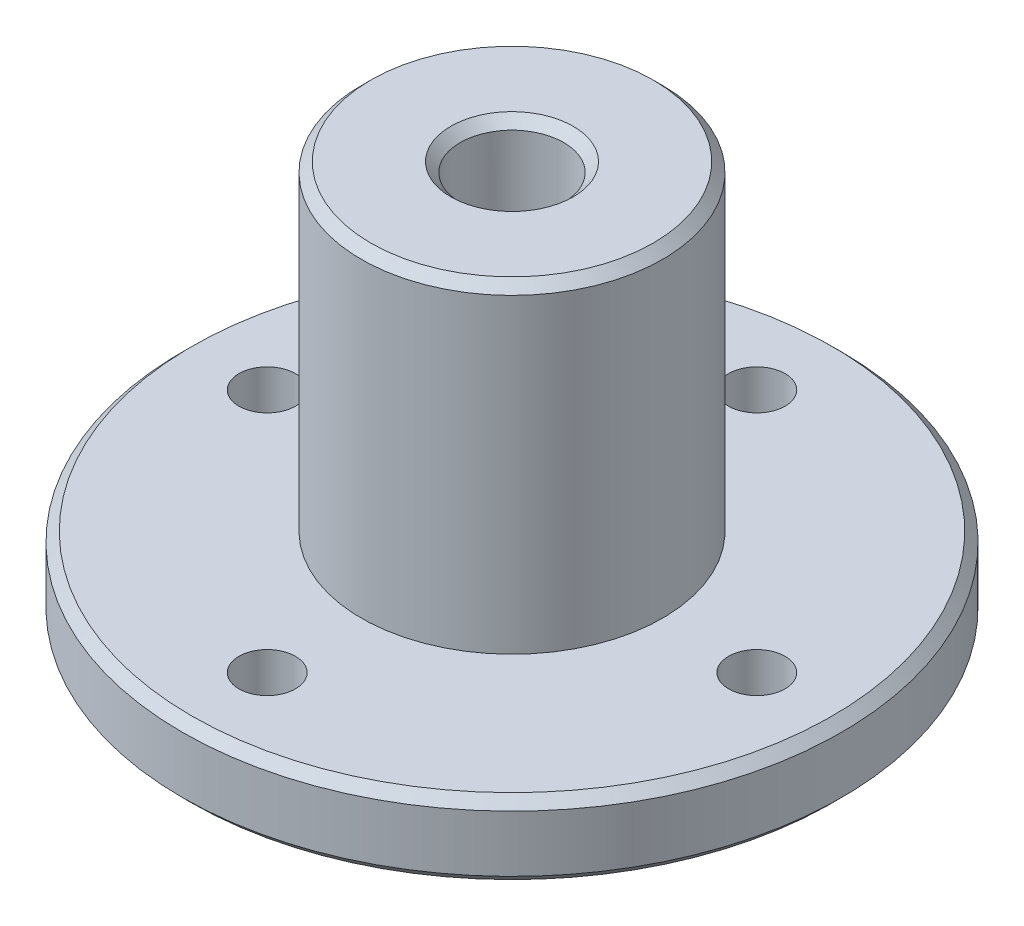
ISO-10303-21;
HEADER;
FILE_DESCRIPTION(('STEP AP214'),'2;1');
FILE_NAME('part.step','',(''),(''),'','','');
FILE_SCHEMA(('AUTOMOTIVE_DESIGN { 1 0 10303 214 1 1 1 1 }'));
ENDSEC;
DATA;
#1=APPLICATION_CONTEXT('core data for automotive mechanical design processes');
#2=APPLICATION_PROTOCOL_DEFINITION('international standard','automotive_design',2000,#1);
#3=PRODUCT_CONTEXT('',#1,'mechanical');
#4=PRODUCT('Part','Part','',(#3));
#5=PRODUCT_RELATED_PRODUCT_CATEGORY('part','',(#4));
#6=PRODUCT_DEFINITION_FORMATION('','',#4);
#7=PRODUCT_DEFINITION_CONTEXT('part definition',#1,'design');
#8=PRODUCT_DEFINITION('design','',#6,#7);
#9=PRODUCT_DEFINITION_SHAPE('','',#8);
#10=(LENGTH_UNIT() NAMED_UNIT(*) SI_UNIT(.MILLI.,.METRE.));
#11=(NAMED_UNIT(*) PLANE_ANGLE_UNIT() SI_UNIT($,.RADIAN.));
#12=(NAMED_UNIT(*) SI_UNIT($,.STERADIAN.) SOLID_ANGLE_UNIT());
#13=UNCERTAINTY_MEASURE_WITH_UNIT(LENGTH_MEASURE(1.E-05),#10,'distance_accuracy_value','');
#14=(GEOMETRIC_REPRESENTATION_CONTEXT(3) GLOBAL_UNCERTAINTY_ASSIGNED_CONTEXT((#13)) GLOBAL_UNIT_ASSIGNED_CONTEXT((#10,
#11,#12)) REPRESENTATION_CONTEXT('',''));
#15=CARTESIAN_POINT('',(0.,0.,0.));
#16=DIRECTION('',(0.,0.,1.));
#17=DIRECTION('',(1.,0.,0.));
#18=AXIS2_PLACEMENT_3D('',#15,#16,#17);
#19=CARTESIAN_POINT('',(0.,-5.,0.));
#20=DIRECTION('',(0.,1.,0.));
#21=DIRECTION('',(0.,0.,1.));
#22=AXIS2_PLACEMENT_3D('',#19,#20,#21);
#23=CYLINDRICAL_SURFACE('',#22,5.5);
#24=CARTESIAN_POINT('',(0.,0.499999999999979,0.));
#25=DIRECTION('',(0.,1.,0.));
#26=DIRECTION('',(0.,0.,1.));
#27=AXIS2_PLACEMENT_3D('',#24,#25,#26);
#28=CIRCLE('',#27,5.5);
#29=CARTESIAN_POINT('',(0.,0.499999999999979,5.5));
#30=VERTEX_POINT('',#29);
#31=EDGE_CURVE('E76',#30,#30,#28,.F.);
#32=CARTESIAN_POINT('',(0.,12.,0.));
#33=DIRECTION('',(0.,1.,0.));
#34=DIRECTION('',(0.,0.,1.));
#35=AXIS2_PLACEMENT_3D('',#32,#33,#34);
#36=CIRCLE('',#35,5.5);
#37=CARTESIAN_POINT('',(0.,12.,5.5));
#38=VERTEX_POINT('',#37);
#39=EDGE_CURVE('E116',#38,#38,#36,.F.);
#40=CARTESIAN_POINT('',(0.,0.499999999999979,5.5));
#41=CARTESIAN_POINT('',(0.,0.619791666666645,5.5));
#42=CARTESIAN_POINT('',(0.,0.739583333333312,5.5));
#43=CARTESIAN_POINT('',(0.,0.979166666666646,5.5));
#44=CARTESIAN_POINT('',(0.,1.09895833333331,5.5));
#45=CARTESIAN_POINT('',(0.,1.33854166666665,5.5));
#46=CARTESIAN_POINT('',(0.,1.45833333333331,5.5));
#47=CARTESIAN_POINT('',(0.,1.69791666666665,5.5));
#48=CARTESIAN_POINT('',(0.,1.81770833333331,5.5));
#49=CARTESIAN_POINT('',(0.,2.05729166666665,5.5));
#50=CARTESIAN_POINT('',(0.,2.17708333333332,5.5));
#51=CARTESIAN_POINT('',(0.,2.41666666666665,5.5));
#52=CARTESIAN_POINT('',(0.,2.53645833333332,5.5));
#53=CARTESIAN_POINT('',(0.,2.77604166666665,5.5));
#54=CARTESIAN_POINT('',(0.,2.89583333333332,5.5));
#55=CARTESIAN_POINT('',(0.,3.13541666666665,5.5));
#56=CARTESIAN_POINT('',(0.,3.25520833333332,5.5));
#57=CARTESIAN_POINT('',(0.,3.49479166666665,5.5));
#58=CARTESIAN_POINT('',(0.,3.61458333333332,5.5));
#59=CARTESIAN_POINT('',(0.,3.85416666666665,5.5));
#60=CARTESIAN_POINT('',(0.,3.97395833333332,5.5));
#61=CARTESIAN_POINT('',(0.,4.21354166666665,5.5));
#62=CARTESIAN_POINT('',(0.,4.33333333333332,5.5));
#63=CARTESIAN_POINT('',(0.,4.57291666666665,5.5));
#64=CARTESIAN_POINT('',(0.,4.69270833333332,5.5));
#65=CARTESIAN_POINT('',(0.,4.93229166666665,5.5));
#66=CARTESIAN_POINT('',(0.,5.05208333333332,5.5));
#67=CARTESIAN_POINT('',(0.,5.29166666666665,5.5));
#68=CARTESIAN_POINT('',(0.,5.41145833333332,5.5));
#69=CARTESIAN_POINT('',(0.,5.65104166666665,5.5));
#70=CARTESIAN_POINT('',(0.,5.77083333333332,5.5));
#71=CARTESIAN_POINT('',(0.,6.01041666666665,5.5));
#72=CARTESIAN_POINT('',(0.,6.13020833333332,5.5));
#73=CARTESIAN_POINT('',(0.,6.36979166666665,5.5));
#74=CARTESIAN_POINT('',(0.,6.48958333333332,5.5));
#75=CARTESIAN_POINT('',(0.,6.72916666666666,5.5));
#76=CARTESIAN_POINT('',(0.,6.84895833333332,5.5));
#77=CARTESIAN_POINT('',(0.,7.08854166666666,5.5));
#78=CARTESIAN_POINT('',(0.,7.20833333333332,5.5));
#79=CARTESIAN_POINT('',(0.,7.44791666666666,5.5));
#80=CARTESIAN_POINT('',(0.,7.56770833333332,5.5));
#81=CARTESIAN_POINT('',(0.,7.80729166666666,5.5));
#82=CARTESIAN_POINT('',(0.,7.92708333333332,5.5));
#83=CARTESIAN_POINT('',(0.,8.16666666666666,5.5));
#84=CARTESIAN_POINT('',(0.,8.28645833333333,5.5));
#85=CARTESIAN_POINT('',(0.,8.52604166666666,5.5));
#86=CARTESIAN_POINT('',(0.,8.64583333333333,5.5));
#87=CARTESIAN_POINT('',(0.,8.88541666666666,5.5));
#88=CARTESIAN_POINT('',(0.,9.00520833333333,5.5));
#89=CARTESIAN_POINT('',(0.,9.24479166666666,5.5));
#90=CARTESIAN_POINT('',(0.,9.36458333333333,5.5));
#91=CARTESIAN_POINT('',(0.,9.60416666666666,5.5));
#92=CARTESIAN_POINT('',(0.,9.72395833333333,5.5));
#93=CARTESIAN_POINT('',(0.,9.96354166666666,5.5));
#94=CARTESIAN_POINT('',(0.,10.0833333333333,5.5));
#95=CARTESIAN_POINT('',(0.,10.3229166666667,5.5));
#96=CARTESIAN_POINT('',(0.,10.4427083333333,5.5));
#97=CARTESIAN_POINT('',(0.,10.6822916666667,5.5));
#98=CARTESIAN_POINT('',(0.,10.8020833333333,5.5));
#99=CARTESIAN_POINT('',(0.,11.0416666666667,5.5));
#100=CARTESIAN_POINT('',(0.,11.1614583333333,5.5));
#101=CARTESIAN_POINT('',(0.,11.4010416666667,5.5));
#102=CARTESIAN_POINT('',(0.,11.5208333333333,5.5));
#103=CARTESIAN_POINT('',(0.,11.7604166666667,5.5));
#104=CARTESIAN_POINT('',(0.,11.8802083333333,5.5));
#105=CARTESIAN_POINT('',(0.,12.,5.5));
#106=B_SPLINE_CURVE_WITH_KNOTS('',3,(#40,#41,#42,#43,#44,#45,#46,#47,#48,#49,#50,#51,#52,#53,
#54,#55,#56,#57,#58,#59,#60,#61,#62,#63,#64,#65,#66,#67,#68,#69,#70,#71,#72,#73,#74,#75,#76,#77,
#78,#79,#80,#81,#82,#83,#84,#85,#86,#87,#88,#89,#90,#91,#92,#93,#94,#95,#96,#97,#98,#99,#100,
#101,#102,#103,#104,#105),.UNSPECIFIED.,.F.,.F.,(4,2,2,2,2,2,2,2,2,2,2,2,2,2,2,2,2,2,2,2,2,2,2,
2,2,2,2,2,2,2,2,2,4),(0.,0.359375,0.718750000000002,1.078125,1.4375,1.796875,2.15625,2.515625,
2.87500000000001,3.23437500000001,3.59375000000001,3.95312500000001,4.31250000000001,
4.67187500000001,5.03125000000001,5.39062500000001,5.75000000000001,6.10937500000001,
6.46875000000001,6.82812500000001,7.18750000000001,7.54687500000001,7.90625000000001,
8.26562500000001,8.62500000000001,8.98437500000002,9.34375000000002,9.70312500000002,10.0625,
10.421875,10.78125,11.140625,11.5),.UNSPECIFIED.);
#107=EDGE_CURVE('BSEAM52',#30,#38,#106,.T.);
#108=ORIENTED_EDGE('',*,*,#31,.T.);
#109=ORIENTED_EDGE('',*,*,#39,.F.);
#110=ORIENTED_EDGE('',*,*,#107,.T.);
#111=ORIENTED_EDGE('',*,*,#107,.F.);
#112=EDGE_LOOP('',(#108,#110,#109,#111));
#113=FACE_BOUND('',#112,.T.);
#114=ADVANCED_FACE('F52',(#113),#23,.F.);
#115=CARTESIAN_POINT('',(0.,4.,0.));
#116=DIRECTION('',(0.,-1.,0.));
#117=DIRECTION('',(0.,0.,-1.));
#118=AXIS2_PLACEMENT_3D('',#115,#116,#117);
#119=CYLINDRICAL_SURFACE('',#118,17.5);
#120=CARTESIAN_POINT('',(0.,0.500000000000004,0.));
#121=DIRECTION('',(0.,1.,0.));
#122=DIRECTION('',(0.,0.,1.));
#123=AXIS2_PLACEMENT_3D('',#120,#121,#122);
#124=CIRCLE('',#123,17.5);
#125=CARTESIAN_POINT('',(0.,0.500000000000004,17.5));
#126=VERTEX_POINT('',#125);
#127=EDGE_CURVE('E97',#126,#126,#124,.T.);
#128=ORIENTED_EDGE('',*,*,#127,.T.);
#129=EDGE_LOOP('',(#128));
#130=FACE_BOUND('',#129,.T.);
#131=CARTESIAN_POINT('',(0.,3.5,0.));
#132=DIRECTION('',(0.,1.,0.));
#133=DIRECTION('',(0.,0.,1.));
#134=AXIS2_PLACEMENT_3D('',#131,#132,#133);
#135=CIRCLE('',#134,17.5);
#136=CARTESIAN_POINT('',(0.,3.5,17.5));
#137=VERTEX_POINT('',#136);
#138=EDGE_CURVE('E100',#137,#137,#135,.F.);
#139=ORIENTED_EDGE('',*,*,#138,.T.);
#140=EDGE_LOOP('',(#139));
#141=FACE_BOUND('',#140,.T.);
#142=ADVANCED_FACE('F155',(#130,#141),#119,.T.);
#143=CARTESIAN_POINT('',(0.,4.,0.));
#144=DIRECTION('',(0.,1.,0.));
#145=DIRECTION('',(0.,0.,1.));
#146=AXIS2_PLACEMENT_3D('',#143,#144,#145);
#147=PLANE('',#146);
#148=CARTESIAN_POINT('',(0.,4.,0.));
#149=DIRECTION('',(0.,1.,0.));
#150=DIRECTION('',(0.,0.,1.));
#151=AXIS2_PLACEMENT_3D('',#148,#149,#150);
#152=CIRCLE('',#151,17.);
#153=CARTESIAN_POINT('',(0.,4.,17.));
#154=VERTEX_POINT('',#153);
#155=EDGE_CURVE('E11',#154,#154,#152,.T.);
#156=ORIENTED_EDGE('',*,*,#155,.T.);
#157=EDGE_LOOP('',(#156));
#158=FACE_BOUND('',#157,.T.);
#159=CARTESIAN_POINT('',(0.,4.,-13.));
#160=DIRECTION('',(0.,1.,0.));
#161=DIRECTION('',(0.,0.,1.));
#162=AXIS2_PLACEMENT_3D('',#159,#160,#161);
#163=CIRCLE('',#162,1.5);
#164=CARTESIAN_POINT('',(0.,4.,-11.5));
#165=VERTEX_POINT('',#164);
#166=EDGE_CURVE('E134',#165,#165,#163,.T.);
#167=ORIENTED_EDGE('',*,*,#166,.F.);
#168=EDGE_LOOP('',(#167));
#169=FACE_BOUND('',#168,.T.);
#170=CARTESIAN_POINT('',(13.,4.,0.));
#171=DIRECTION('',(0.,1.,0.));
#172=DIRECTION('',(0.,0.,1.));
#173=AXIS2_PLACEMENT_3D('',#170,#171,#172);
#174=CIRCLE('',#173,1.5);
#175=CARTESIAN_POINT('',(13.,4.,1.5));
#176=VERTEX_POINT('',#175);
#177=EDGE_CURVE('E143',#176,#176,#174,.T.);
#178=ORIENTED_EDGE('',*,*,#177,.F.);
#179=EDGE_LOOP('',(#178));
#180=FACE_BOUND('',#179,.T.);
#181=CARTESIAN_POINT('',(0.,4.,13.));
#182=DIRECTION('',(0.,1.,0.));
#183=DIRECTION('',(0.,0.,1.));
#184=AXIS2_PLACEMENT_3D('',#181,#182,#183);
#185=CIRCLE('',#184,1.5);
#186=CARTESIAN_POINT('',(0.,4.,14.5));
#187=VERTEX_POINT('',#186);
#188=EDGE_CURVE('E140',#187,#187,#185,.T.);
#189=ORIENTED_EDGE('',*,*,#188,.F.);
#190=EDGE_LOOP('',(#189));
#191=FACE_BOUND('',#190,.T.);
#192=CARTESIAN_POINT('',(-13.,4.,0.));
#193=DIRECTION('',(0.,1.,0.));
#194=DIRECTION('',(0.,0.,1.));
#195=AXIS2_PLACEMENT_3D('',#192,#193,#194);
#196=CIRCLE('',#195,1.5);
#197=CARTESIAN_POINT('',(-13.,4.,1.5));
#198=VERTEX_POINT('',#197);
#199=EDGE_CURVE('E137',#198,#198,#196,.T.);
#200=ORIENTED_EDGE('',*,*,#199,.F.);
#201=EDGE_LOOP('',(#200));
#202=FACE_BOUND('',#201,.T.);
#203=CARTESIAN_POINT('',(0.,4.,0.));
#204=DIRECTION('',(0.,1.,0.));
#205=DIRECTION('',(0.,0.,1.));
#206=AXIS2_PLACEMENT_3D('',#203,#204,#205);
#207=CIRCLE('',#206,8.);
#208=CARTESIAN_POINT('',(0.,4.,-8.));
#209=VERTEX_POINT('',#208);
#210=EDGE_CURVE('E115',#209,#209,#207,.F.);
#211=ORIENTED_EDGE('',*,*,#210,.T.);
#212=EDGE_LOOP('',(#211));
#213=FACE_BOUND('',#212,.T.);
#214=ADVANCED_FACE('F151',(#158,#169,#180,#191,#202,#213),#147,.T.);
#215=CARTESIAN_POINT('',(0.,0.,0.));
#216=DIRECTION('',(0.,1.,0.));
#217=DIRECTION('',(0.,0.,1.));
#218=AXIS2_PLACEMENT_3D('',#215,#216,#217);
#219=PLANE('',#218);
#220=CARTESIAN_POINT('',(0.,0.,0.));
#221=DIRECTION('',(0.,1.,0.));
#222=DIRECTION('',(0.,0.,1.));
#223=AXIS2_PLACEMENT_3D('',#220,#221,#222);
#224=CIRCLE('',#223,17.);
#225=CARTESIAN_POINT('',(0.,0.,17.));
#226=VERTEX_POINT('',#225);
#227=EDGE_CURVE('E79',#226,#226,#224,.F.);
#228=ORIENTED_EDGE('',*,*,#227,.T.);
#229=EDGE_LOOP('',(#228));
#230=FACE_BOUND('',#229,.T.);
#231=CARTESIAN_POINT('',(0.,0.,0.));
#232=DIRECTION('',(0.,1.,0.));
#233=DIRECTION('',(0.,0.,1.));
#234=AXIS2_PLACEMENT_3D('',#231,#232,#233);
#235=CIRCLE('',#234,5.99999999999998);
#236=CARTESIAN_POINT('',(0.,0.,5.99999999999998));
#237=VERTEX_POINT('',#236);
#238=EDGE_CURVE('E82',#237,#237,#235,.T.);
#239=ORIENTED_EDGE('',*,*,#238,.T.);
#240=EDGE_LOOP('',(#239));
#241=FACE_BOUND('',#240,.T.);
#242=CARTESIAN_POINT('',(-13.,0.,0.));
#243=DIRECTION('',(0.,1.,0.));
#244=DIRECTION('',(0.,0.,1.));
#245=AXIS2_PLACEMENT_3D('',#242,#243,#244);
#246=CIRCLE('',#245,2.);
#247=CARTESIAN_POINT('',(-13.,0.,2.));
#248=VERTEX_POINT('',#247);
#249=EDGE_CURVE('E85',#248,#248,#246,.T.);
#250=ORIENTED_EDGE('',*,*,#249,.T.);
#251=EDGE_LOOP('',(#250));
#252=FACE_BOUND('',#251,.T.);
#253=CARTESIAN_POINT('',(0.,0.,13.));
#254=DIRECTION('',(0.,1.,0.));
#255=DIRECTION('',(0.,0.,1.));
#256=AXIS2_PLACEMENT_3D('',#253,#254,#255);
#257=CIRCLE('',#256,2.);
#258=CARTESIAN_POINT('',(0.,0.,15.));
#259=VERTEX_POINT('',#258);
#260=EDGE_CURVE('E88',#259,#259,#257,.T.);
#261=ORIENTED_EDGE('',*,*,#260,.T.);
#262=EDGE_LOOP('',(#261));
#263=FACE_BOUND('',#262,.T.);
#264=CARTESIAN_POINT('',(13.,0.,0.));
#265=DIRECTION('',(0.,1.,0.));
#266=DIRECTION('',(0.,0.,1.));
#267=AXIS2_PLACEMENT_3D('',#264,#265,#266);
#268=CIRCLE('',#267,2.);
#269=CARTESIAN_POINT('',(13.,0.,2.));
#270=VERTEX_POINT('',#269);
#271=EDGE_CURVE('E91',#270,#270,#268,.T.);
#272=ORIENTED_EDGE('',*,*,#271,.T.);
#273=EDGE_LOOP('',(#272));
#274=FACE_BOUND('',#273,.T.);
#275=CARTESIAN_POINT('',(0.,0.,-13.));
#276=DIRECTION('',(0.,1.,0.));
#277=DIRECTION('',(0.,0.,1.));
#278=AXIS2_PLACEMENT_3D('',#275,#276,#277);
#279=CIRCLE('',#278,2.);
#280=CARTESIAN_POINT('',(0.,0.,-11.));
#281=VERTEX_POINT('',#280);
#282=EDGE_CURVE('E94',#281,#281,#279,.T.);
#283=ORIENTED_EDGE('',*,*,#282,.T.);
#284=EDGE_LOOP('',(#283));
#285=FACE_BOUND('',#284,.T.);
#286=ADVANCED_FACE('F154',(#230,#241,#252,#263,#274,#285),#219,.F.);
#287=CARTESIAN_POINT('',(0.,21.,0.));
#288=DIRECTION('',(0.,1.,0.));
#289=DIRECTION('',(0.,0.,1.));
#290=AXIS2_PLACEMENT_3D('',#287,#288,#289);
#291=PLANE('',#290);
#292=CARTESIAN_POINT('',(0.,21.,0.));
#293=DIRECTION('',(0.,1.,0.));
#294=DIRECTION('',(0.,0.,1.));
#295=AXIS2_PLACEMENT_3D('',#292,#293,#294);
#296=CIRCLE('',#295,3.25000000000004);
#297=CARTESIAN_POINT('',(0.,21.,3.25000000000004));
#298=VERTEX_POINT('',#297);
#299=EDGE_CURVE('E106',#298,#298,#296,.F.);
#300=ORIENTED_EDGE('',*,*,#299,.T.);
#301=EDGE_LOOP('',(#300));
#302=FACE_BOUND('',#301,.T.);
#303=CARTESIAN_POINT('',(0.,21.,0.));
#304=DIRECTION('',(0.,1.,0.));
#305=DIRECTION('',(0.,0.,1.));
#306=AXIS2_PLACEMENT_3D('',#303,#304,#305);
#307=CIRCLE('',#306,7.50000000000002);
#308=CARTESIAN_POINT('',(0.,21.,7.50000000000002));
#309=VERTEX_POINT('',#308);
#310=EDGE_CURVE('E109',#309,#309,#307,.T.);
#311=ORIENTED_EDGE('',*,*,#310,.T.);
#312=EDGE_LOOP('',(#311));
#313=FACE_BOUND('',#312,.T.);
#314=ADVANCED_FACE('F168',(#302,#313),#291,.T.);
#315=CARTESIAN_POINT('',(0.,21.,0.));
#316=DIRECTION('',(0.,-1.,0.));
#317=DIRECTION('',(0.,0.,-1.));
#318=AXIS2_PLACEMENT_3D('',#315,#316,#317);
#319=CYLINDRICAL_SURFACE('',#318,8.);
#320=CARTESIAN_POINT('',(0.,20.5,0.));
#321=DIRECTION('',(0.,1.,0.));
#322=DIRECTION('',(0.,0.,1.));
#323=AXIS2_PLACEMENT_3D('',#320,#321,#322);
#324=CIRCLE('',#323,8.);
#325=CARTESIAN_POINT('',(0.,20.5,-8.));
#326=VERTEX_POINT('',#325);
#327=EDGE_CURVE('E103',#326,#326,#324,.F.);
#328=CARTESIAN_POINT('',(0.,20.5,-8.));
#329=CARTESIAN_POINT('',(0.,20.328125,-8.));
#330=CARTESIAN_POINT('',(0.,20.15625,-8.));
#331=CARTESIAN_POINT('',(0.,19.8125,-8.));
#332=CARTESIAN_POINT('',(0.,19.640625,-8.));
#333=CARTESIAN_POINT('',(0.,19.296875,-8.));
#334=CARTESIAN_POINT('',(0.,19.125,-8.));
#335=CARTESIAN_POINT('',(0.,18.78125,-8.));
#336=CARTESIAN_POINT('',(0.,18.609375,-8.));
#337=CARTESIAN_POINT('',(0.,18.265625,-8.));
#338=CARTESIAN_POINT('',(0.,18.09375,-8.));
#339=CARTESIAN_POINT('',(0.,17.75,-8.));
#340=CARTESIAN_POINT('',(0.,17.578125,-8.));
#341=CARTESIAN_POINT('',(0.,17.234375,-8.));
#342=CARTESIAN_POINT('',(0.,17.0625,-8.));
#343=CARTESIAN_POINT('',(0.,16.71875,-8.));
#344=CARTESIAN_POINT('',(0.,16.546875,-8.));
#345=CARTESIAN_POINT('',(0.,16.203125,-8.));
#346=CARTESIAN_POINT('',(0.,16.03125,-8.));
#347=CARTESIAN_POINT('',(0.,15.6875,-8.));
#348=CARTESIAN_POINT('',(0.,15.515625,-8.));
#349=CARTESIAN_POINT('',(0.,15.171875,-8.));
#350=CARTESIAN_POINT('',(0.,15.,-8.));
#351=CARTESIAN_POINT('',(0.,14.65625,-8.));
#352=CARTESIAN_POINT('',(0.,14.484375,-8.));
#353=CARTESIAN_POINT('',(0.,14.140625,-8.));
#354=CARTESIAN_POINT('',(0.,13.96875,-8.));
#355=CARTESIAN_POINT('',(0.,13.625,-8.));
#356=CARTESIAN_POINT('',(0.,13.453125,-8.));
#357=CARTESIAN_POINT('',(0.,13.109375,-8.));
#358=CARTESIAN_POINT('',(0.,12.9375,-8.));
#359=CARTESIAN_POINT('',(0.,12.59375,-8.));
#360=CARTESIAN_POINT('',(0.,12.421875,-8.));
#361=CARTESIAN_POINT('',(0.,12.078125,-8.));
#362=CARTESIAN_POINT('',(0.,11.90625,-8.));
#363=CARTESIAN_POINT('',(0.,11.5625,-8.));
#364=CARTESIAN_POINT('',(0.,11.390625,-8.));
#365=CARTESIAN_POINT('',(0.,11.046875,-8.));
#366=CARTESIAN_POINT('',(0.,10.875,-8.));
#367=CARTESIAN_POINT('',(0.,10.53125,-8.));
#368=CARTESIAN_POINT('',(0.,10.359375,-8.));
#369=CARTESIAN_POINT('',(0.,10.015625,-8.));
#370=CARTESIAN_POINT('',(0.,9.84375,-8.));
#371=CARTESIAN_POINT('',(0.,9.5,-8.));
#372=CARTESIAN_POINT('',(0.,9.328125,-8.));
#373=CARTESIAN_POINT('',(0.,8.984375,-8.));
#374=CARTESIAN_POINT('',(0.,8.8125,-8.));
#375=CARTESIAN_POINT('',(0.,8.46875,-8.));
#376=CARTESIAN_POINT('',(0.,8.296875,-8.));
#377=CARTESIAN_POINT('',(0.,7.953125,-8.));
#378=CARTESIAN_POINT('',(0.,7.78125,-8.));
#379=CARTESIAN_POINT('',(0.,7.4375,-8.));
#380=CARTESIAN_POINT('',(0.,7.265625,-8.));
#381=CARTESIAN_POINT('',(0.,6.921875,-8.));
#382=CARTESIAN_POINT('',(0.,6.75,-8.));
#383=CARTESIAN_POINT('',(0.,6.40625,-8.));
#384=CARTESIAN_POINT('',(0.,6.234375,-8.));
#385=CARTESIAN_POINT('',(0.,5.890625,-8.));
#386=CARTESIAN_POINT('',(0.,5.71875,-8.));
#387=CARTESIAN_POINT('',(0.,5.375,-8.));
#388=CARTESIAN_POINT('',(0.,5.203125,-8.));
#389=CARTESIAN_POINT('',(0.,4.859375,-8.));
#390=CARTESIAN_POINT('',(0.,4.6875,-8.));
#391=CARTESIAN_POINT('',(0.,4.34375,-8.));
#392=CARTESIAN_POINT('',(0.,4.171875,-8.));
#393=CARTESIAN_POINT('',(0.,4.,-8.));
#394=B_SPLINE_CURVE_WITH_KNOTS('',3,(#328,#329,#330,#331,#332,#333,#334,#335,#336,#337,#338,
#339,#340,#341,#342,#343,#344,#345,#346,#347,#348,#349,#350,#351,#352,#353,#354,#355,#356,#357,
#358,#359,#360,#361,#362,#363,#364,#365,#366,#367,#368,#369,#370,#371,#372,#373,#374,#375,#376,
#377,#378,#379,#380,#381,#382,#383,#384,#385,#386,#387,#388,#389,#390,#391,#392,#393),
.UNSPECIFIED.,.F.,.F.,(4,2,2,2,2,2,2,2,2,2,2,2,2,2,2,2,2,2,2,2,2,2,2,2,2,2,2,2,2,2,2,2,4),(0.,
0.515624999999999,1.03125,1.546875,2.0625,2.578125,3.09375,3.609375,4.125,4.640625,5.15625,
5.67187500000001,6.18750000000001,6.70312500000001,7.21875000000001,7.73437500000001,
8.25000000000001,8.76562500000001,9.28125000000001,9.79687500000001,10.3125,10.828125,11.34375,
11.859375,12.375,12.890625,13.40625,13.921875,14.4375,14.953125,15.46875,15.984375,16.5),.UNSPECIFIED.);
#395=EDGE_CURVE('BSEAM165',#326,#209,#394,.T.);
#396=ORIENTED_EDGE('',*,*,#327,.T.);
#397=ORIENTED_EDGE('',*,*,#210,.F.);
#398=ORIENTED_EDGE('',*,*,#395,.T.);
#399=ORIENTED_EDGE('',*,*,#395,.F.);
#400=EDGE_LOOP('',(#396,#398,#397,#399));
#401=FACE_BOUND('',#400,.T.);
#402=ADVANCED_FACE('F165',(#401),#319,.T.);
#403=CARTESIAN_POINT('',(0.,21.,0.));
#404=DIRECTION('',(0.,-1.,0.));
#405=DIRECTION('',(0.,0.,-1.));
#406=AXIS2_PLACEMENT_3D('',#403,#404,#405);
#407=CYLINDRICAL_SURFACE('',#406,2.75);
#408=CARTESIAN_POINT('',(0.,20.5,0.));
#409=DIRECTION('',(0.,1.,0.));
#410=DIRECTION('',(0.,0.,1.));
#411=AXIS2_PLACEMENT_3D('',#408,#409,#410);
#412=CIRCLE('',#411,2.75);
#413=CARTESIAN_POINT('',(0.,20.5,-2.75));
#414=VERTEX_POINT('',#413);
#415=EDGE_CURVE('E112',#414,#414,#412,.T.);
#416=CARTESIAN_POINT('',(0.,16.,0.));
#417=DIRECTION('',(0.,1.,0.));
#418=DIRECTION('',(0.,0.,1.));
#419=AXIS2_PLACEMENT_3D('',#416,#417,#418);
#420=CIRCLE('',#419,2.75);
#421=CARTESIAN_POINT('',(0.,16.,-2.75));
#422=VERTEX_POINT('',#421);
#423=EDGE_CURVE('E124',#422,#422,#420,.T.);
#424=CARTESIAN_POINT('',(0.,20.5,-2.75));
#425=CARTESIAN_POINT('',(0.,20.453125,-2.75));
#426=CARTESIAN_POINT('',(0.,20.40625,-2.75));
#427=CARTESIAN_POINT('',(0.,20.3125,-2.75));
#428=CARTESIAN_POINT('',(0.,20.265625,-2.75));
#429=CARTESIAN_POINT('',(0.,20.171875,-2.75));
#430=CARTESIAN_POINT('',(0.,20.125,-2.75));
#431=CARTESIAN_POINT('',(0.,20.03125,-2.75));
#432=CARTESIAN_POINT('',(0.,19.984375,-2.75));
#433=CARTESIAN_POINT('',(0.,19.890625,-2.75));
#434=CARTESIAN_POINT('',(0.,19.84375,-2.75));
#435=CARTESIAN_POINT('',(0.,19.75,-2.75));
#436=CARTESIAN_POINT('',(0.,19.703125,-2.75));
#437=CARTESIAN_POINT('',(0.,19.609375,-2.75));
#438=CARTESIAN_POINT('',(0.,19.5625,-2.75));
#439=CARTESIAN_POINT('',(0.,19.46875,-2.75));
#440=CARTESIAN_POINT('',(0.,19.421875,-2.75));
#441=CARTESIAN_POINT('',(0.,19.328125,-2.75));
#442=CARTESIAN_POINT('',(0.,19.28125,-2.75));
#443=CARTESIAN_POINT('',(0.,19.1875,-2.75));
#444=CARTESIAN_POINT('',(0.,19.140625,-2.75));
#445=CARTESIAN_POINT('',(0.,19.046875,-2.75));
#446=CARTESIAN_POINT('',(0.,19.,-2.75));
#447=CARTESIAN_POINT('',(0.,18.90625,-2.75));
#448=CARTESIAN_POINT('',(0.,18.859375,-2.75));
#449=CARTESIAN_POINT('',(0.,18.765625,-2.75));
#450=CARTESIAN_POINT('',(0.,18.71875,-2.75));
#451=CARTESIAN_POINT('',(0.,18.625,-2.75));
#452=CARTESIAN_POINT('',(0.,18.578125,-2.75));
#453=CARTESIAN_POINT('',(0.,18.484375,-2.75));
#454=CARTESIAN_POINT('',(0.,18.4375,-2.75));
#455=CARTESIAN_POINT('',(0.,18.34375,-2.75));
#456=CARTESIAN_POINT('',(0.,18.296875,-2.75));
#457=CARTESIAN_POINT('',(0.,18.203125,-2.75));
#458=CARTESIAN_POINT('',(0.,18.15625,-2.75));
#459=CARTESIAN_POINT('',(0.,18.0625,-2.75));
#460=CARTESIAN_POINT('',(0.,18.015625,-2.75));
#461=CARTESIAN_POINT('',(0.,17.921875,-2.75));
#462=CARTESIAN_POINT('',(0.,17.875,-2.75));
#463=CARTESIAN_POINT('',(0.,17.78125,-2.75));
#464=CARTESIAN_POINT('',(0.,17.734375,-2.75));
#465=CARTESIAN_POINT('',(0.,17.640625,-2.75));
#466=CARTESIAN_POINT('',(0.,17.59375,-2.75));
#467=CARTESIAN_POINT('',(0.,17.5,-2.75));
#468=CARTESIAN_POINT('',(0.,17.453125,-2.75));
#469=CARTESIAN_POINT('',(0.,17.359375,-2.75));
#470=CARTESIAN_POINT('',(0.,17.3125,-2.75));
#471=CARTESIAN_POINT('',(0.,17.21875,-2.75));
#472=CARTESIAN_POINT('',(0.,17.171875,-2.75));
#473=CARTESIAN_POINT('',(0.,17.078125,-2.75));
#474=CARTESIAN_POINT('',(0.,17.03125,-2.75));
#475=CARTESIAN_POINT('',(0.,16.9375,-2.75));
#476=CARTESIAN_POINT('',(0.,16.890625,-2.75));
#477=CARTESIAN_POINT('',(0.,16.796875,-2.75));
#478=CARTESIAN_POINT('',(0.,16.75,-2.75));
#479=CARTESIAN_POINT('',(0.,16.65625,-2.75));
#480=CARTESIAN_POINT('',(0.,16.609375,-2.75));
#481=CARTESIAN_POINT('',(0.,16.515625,-2.75));
#482=CARTESIAN_POINT('',(0.,16.46875,-2.75));
#483=CARTESIAN_POINT('',(0.,16.375,-2.75));
#484=CARTESIAN_POINT('',(0.,16.328125,-2.75));
#485=CARTESIAN_POINT('',(0.,16.234375,-2.75));
#486=CARTESIAN_POINT('',(0.,16.1875,-2.75));
#487=CARTESIAN_POINT('',(0.,16.09375,-2.75));
#488=CARTESIAN_POINT('',(0.,16.046875,-2.75));
#489=CARTESIAN_POINT('',(0.,16.,-2.75));
#490=B_SPLINE_CURVE_WITH_KNOTS('',3,(#424,#425,#426,#427,#428,#429,#430,#431,#432,#433,#434,
#435,#436,#437,#438,#439,#440,#441,#442,#443,#444,#445,#446,#447,#448,#449,#450,#451,#452,#453,
#454,#455,#456,#457,#458,#459,#460,#461,#462,#463,#464,#465,#466,#467,#468,#469,#470,#471,#472,
#473,#474,#475,#476,#477,#478,#479,#480,#481,#482,#483,#484,#485,#486,#487,#488,#489),
.UNSPECIFIED.,.F.,.F.,(4,2,2,2,2,2,2,2,2,2,2,2,2,2,2,2,2,2,2,2,2,2,2,2,2,2,2,2,2,2,2,2,4),(0.,
0.140624999999998,0.281249999999997,0.421874999999995,0.562499999999994,0.703124999999995,
0.843749999999994,0.984374999999992,1.12499999999999,1.26562499999999,1.40624999999999,
1.54687499999999,1.68749999999999,1.82812499999999,1.96874999999998,2.10937499999998,
2.24999999999998,2.39062499999998,2.53124999999998,2.67187499999998,2.81249999999998,
2.95312499999998,3.09374999999998,3.23437499999998,3.37499999999998,3.51562499999998,
3.65624999999998,3.79687499999997,3.93749999999997,4.07812499999997,4.21874999999997,
4.35937499999997,4.49999999999997),.UNSPECIFIED.);
#491=EDGE_CURVE('BSEAM167',#414,#422,#490,.T.);
#492=ORIENTED_EDGE('',*,*,#415,.T.);
#493=ORIENTED_EDGE('',*,*,#423,.F.);
#494=ORIENTED_EDGE('',*,*,#491,.T.);
#495=ORIENTED_EDGE('',*,*,#491,.F.);
#496=EDGE_LOOP('',(#492,#494,#493,#495));
#497=FACE_BOUND('',#496,.T.);
#498=ADVANCED_FACE('F167',(#497),#407,.F.);
#499=CARTESIAN_POINT('',(0.,13.1,0.));
#500=DIRECTION('',(0.,1.,0.));
#501=DIRECTION('',(0.,0.,1.));
#502=AXIS2_PLACEMENT_3D('',#499,#500,#501);
#503=CIRCLE('',#502,5.5);
#504=CARTESIAN_POINT('',(0.,13.1,5.5));
#505=VERTEX_POINT('',#504);
#506=EDGE_CURVE('E120',#505,#505,#503,.F.);
#507=CARTESIAN_POINT('',(0.,16.,0.));
#508=DIRECTION('',(0.,1.,0.));
#509=DIRECTION('',(0.,0.,1.));
#510=AXIS2_PLACEMENT_3D('',#507,#508,#509);
#511=CIRCLE('',#510,5.5);
#512=CARTESIAN_POINT('',(0.,16.,5.5));
#513=VERTEX_POINT('',#512);
#514=EDGE_CURVE('E119',#513,#513,#511,.T.);
#515=CARTESIAN_POINT('',(0.,13.1,5.5));
#516=CARTESIAN_POINT('',(0.,13.1302083333333,5.5));
#517=CARTESIAN_POINT('',(0.,13.1604166666667,5.5));
#518=CARTESIAN_POINT('',(0.,13.2208333333333,5.5));
#519=CARTESIAN_POINT('',(0.,13.2510416666667,5.5));
#520=CARTESIAN_POINT('',(0.,13.3114583333333,5.5));
#521=CARTESIAN_POINT('',(0.,13.3416666666667,5.5));
#522=CARTESIAN_POINT('',(0.,13.4020833333333,5.5));
#523=CARTESIAN_POINT('',(0.,13.4322916666667,5.5));
#524=CARTESIAN_POINT('',(0.,13.4927083333333,5.5));
#525=CARTESIAN_POINT('',(0.,13.5229166666667,5.5));
#526=CARTESIAN_POINT('',(0.,13.5833333333333,5.5));
#527=CARTESIAN_POINT('',(0.,13.6135416666667,5.5));
#528=CARTESIAN_POINT('',(0.,13.6739583333333,5.5));
#529=CARTESIAN_POINT('',(0.,13.7041666666667,5.5));
#530=CARTESIAN_POINT('',(0.,13.7645833333333,5.5));
#531=CARTESIAN_POINT('',(0.,13.7947916666667,5.5));
#532=CARTESIAN_POINT('',(0.,13.8552083333333,5.5));
#533=CARTESIAN_POINT('',(0.,13.8854166666667,5.5));
#534=CARTESIAN_POINT('',(0.,13.9458333333333,5.5));
#535=CARTESIAN_POINT('',(0.,13.9760416666667,5.5));
#536=CARTESIAN_POINT('',(0.,14.0364583333333,5.5));
#537=CARTESIAN_POINT('',(0.,14.0666666666667,5.5));
#538=CARTESIAN_POINT('',(0.,14.1270833333333,5.5));
#539=CARTESIAN_POINT('',(0.,14.1572916666667,5.5));
#540=CARTESIAN_POINT('',(0.,14.2177083333333,5.5));
#541=CARTESIAN_POINT('',(0.,14.2479166666667,5.5));
#542=CARTESIAN_POINT('',(0.,14.3083333333333,5.5));
#543=CARTESIAN_POINT('',(0.,14.3385416666667,5.5));
#544=CARTESIAN_POINT('',(0.,14.3989583333333,5.5));
#545=CARTESIAN_POINT('',(0.,14.4291666666667,5.5));
#546=CARTESIAN_POINT('',(0.,14.4895833333333,5.5));
#547=CARTESIAN_POINT('',(0.,14.5197916666667,5.5));
#548=CARTESIAN_POINT('',(0.,14.5802083333333,5.5));
#549=CARTESIAN_POINT('',(0.,14.6104166666667,5.5));
#550=CARTESIAN_POINT('',(0.,14.6708333333333,5.5));
#551=CARTESIAN_POINT('',(0.,14.7010416666667,5.5));
#552=CARTESIAN_POINT('',(0.,14.7614583333333,5.5));
#553=CARTESIAN_POINT('',(0.,14.7916666666667,5.5));
#554=CARTESIAN_POINT('',(0.,14.8520833333333,5.5));
#555=CARTESIAN_POINT('',(0.,14.8822916666667,5.5));
#556=CARTESIAN_POINT('',(0.,14.9427083333333,5.5));
#557=CARTESIAN_POINT('',(0.,14.9729166666667,5.5));
#558=CARTESIAN_POINT('',(0.,15.0333333333333,5.5));
#559=CARTESIAN_POINT('',(0.,15.0635416666667,5.5));
#560=CARTESIAN_POINT('',(0.,15.1239583333333,5.5));
#561=CARTESIAN_POINT('',(0.,15.1541666666667,5.5));
#562=CARTESIAN_POINT('',(0.,15.2145833333333,5.5));
#563=CARTESIAN_POINT('',(0.,15.2447916666667,5.5));
#564=CARTESIAN_POINT('',(0.,15.3052083333333,5.5));
#565=CARTESIAN_POINT('',(0.,15.3354166666667,5.5));
#566=CARTESIAN_POINT('',(0.,15.3958333333333,5.5));
#567=CARTESIAN_POINT('',(0.,15.4260416666667,5.5));
#568=CARTESIAN_POINT('',(0.,15.4864583333333,5.5));
#569=CARTESIAN_POINT('',(0.,15.5166666666667,5.5));
#570=CARTESIAN_POINT('',(0.,15.5770833333333,5.5));
#571=CARTESIAN_POINT('',(0.,15.6072916666667,5.5));
#572=CARTESIAN_POINT('',(0.,15.6677083333333,5.5));
#573=CARTESIAN_POINT('',(0.,15.6979166666667,5.5));
#574=CARTESIAN_POINT('',(0.,15.7583333333333,5.5));
#575=CARTESIAN_POINT('',(0.,15.7885416666667,5.5));
#576=CARTESIAN_POINT('',(0.,15.8489583333333,5.5));
#577=CARTESIAN_POINT('',(0.,15.8791666666667,5.5));
#578=CARTESIAN_POINT('',(0.,15.9395833333333,5.5));
#579=CARTESIAN_POINT('',(0.,15.9697916666667,5.5));
#580=CARTESIAN_POINT('',(0.,16.,5.5));
#581=B_SPLINE_CURVE_WITH_KNOTS('',3,(#515,#516,#517,#518,#519,#520,#521,#522,#523,#524,#525,
#526,#527,#528,#529,#530,#531,#532,#533,#534,#535,#536,#537,#538,#539,#540,#541,#542,#543,#544,
#545,#546,#547,#548,#549,#550,#551,#552,#553,#554,#555,#556,#557,#558,#559,#560,#561,#562,#563,
#564,#565,#566,#567,#568,#569,#570,#571,#572,#573,#574,#575,#576,#577,#578,#579,#580),
.UNSPECIFIED.,.F.,.F.,(4,2,2,2,2,2,2,2,2,2,2,2,2,2,2,2,2,2,2,2,2,2,2,2,2,2,2,2,2,2,2,2,4),(0.,
0.0906250000000004,0.181250000000001,0.271875000000001,0.362500000000002,0.453124999999999,
0.543749999999999,0.634374999999999,0.725,0.815625,0.906250000000001,0.996875000000001,1.0875,
1.178125,1.26875,1.359375,1.45,1.540625,1.63125,1.721875,1.8125,1.903125,1.99375,2.084375,2.175,
2.265625,2.35625,2.446875,2.5375,2.628125,2.71875,2.809375,2.9),.UNSPECIFIED.);
#582=EDGE_CURVE('BSEAM175',#505,#513,#581,.T.);
#583=ORIENTED_EDGE('',*,*,#506,.T.);
#584=ORIENTED_EDGE('',*,*,#514,.T.);
#585=ORIENTED_EDGE('',*,*,#582,.T.);
#586=ORIENTED_EDGE('',*,*,#582,.F.);
#587=EDGE_LOOP('',(#583,#585,#584,#586));
#588=FACE_BOUND('',#587,.T.);
#589=ADVANCED_FACE('F175',(#588),#23,.F.);
#590=CARTESIAN_POINT('',(0.,16.,0.));
#591=DIRECTION('',(0.,1.,0.));
#592=DIRECTION('',(0.,0.,1.));
#593=AXIS2_PLACEMENT_3D('',#590,#591,#592);
#594=PLANE('',#593);
#595=ORIENTED_EDGE('',*,*,#423,.T.);
#596=EDGE_LOOP('',(#595));
#597=FACE_BOUND('',#596,.T.);
#598=ORIENTED_EDGE('',*,*,#514,.F.);
#599=EDGE_LOOP('',(#598));
#600=FACE_BOUND('',#599,.T.);
#601=ADVANCED_FACE('F190',(#597,#600),#594,.F.);
#602=CARTESIAN_POINT('',(0.,12.,0.));
#603=DIRECTION('',(0.,1.,0.));
#604=DIRECTION('',(0.,0.,1.));
#605=AXIS2_PLACEMENT_3D('',#602,#603,#604);
#606=PLANE('',#605);
#607=CARTESIAN_POINT('',(0.,12.,0.));
#608=DIRECTION('',(0.,1.,0.));
#609=DIRECTION('',(0.,0.,1.));
#610=AXIS2_PLACEMENT_3D('',#607,#608,#609);
#611=CIRCLE('',#610,6.);
#612=CARTESIAN_POINT('',(0.,12.,6.));
#613=VERTEX_POINT('',#612);
#614=EDGE_CURVE('E123',#613,#613,#611,.T.);
#615=ORIENTED_EDGE('',*,*,#614,.T.);
#616=EDGE_LOOP('',(#615));
#617=FACE_BOUND('',#616,.T.);
#618=ORIENTED_EDGE('',*,*,#39,.T.);
#619=EDGE_LOOP('',(#618));
#620=FACE_BOUND('',#619,.T.);
#621=ADVANCED_FACE('F195',(#617,#620),#606,.T.);
#622=CARTESIAN_POINT('',(0.,13.1,0.));
#623=DIRECTION('',(0.,1.,0.));
#624=DIRECTION('',(0.,0.,1.));
#625=AXIS2_PLACEMENT_3D('',#622,#623,#624);
#626=PLANE('',#625);
#627=CARTESIAN_POINT('',(0.,13.1,0.));
#628=DIRECTION('',(0.,1.,0.));
#629=DIRECTION('',(0.,0.,1.));
#630=AXIS2_PLACEMENT_3D('',#627,#628,#629);
#631=CIRCLE('',#630,6.);
#632=CARTESIAN_POINT('',(0.,13.1,6.));
#633=VERTEX_POINT('',#632);
#634=EDGE_CURVE('E131',#633,#633,#631,.T.);
#635=ORIENTED_EDGE('',*,*,#634,.F.);
#636=EDGE_LOOP('',(#635));
#637=FACE_BOUND('',#636,.T.);
#638=ORIENTED_EDGE('',*,*,#506,.F.);
#639=EDGE_LOOP('',(#638));
#640=FACE_BOUND('',#639,.T.);
#641=ADVANCED_FACE('F202',(#637,#640),#626,.F.);
#642=CARTESIAN_POINT('',(0.,12.,0.));
#643=DIRECTION('',(0.,1.,0.));
#644=DIRECTION('',(0.,0.,1.));
#645=AXIS2_PLACEMENT_3D('',#642,#643,#644);
#646=CYLINDRICAL_SURFACE('',#645,6.);
#647=ORIENTED_EDGE('',*,*,#614,.F.);
#648=EDGE_LOOP('',(#647));
#649=FACE_BOUND('',#648,.T.);
#650=ORIENTED_EDGE('',*,*,#634,.T.);
#651=EDGE_LOOP('',(#650));
#652=FACE_BOUND('',#651,.T.);
#653=ADVANCED_FACE('F204',(#649,#652),#646,.F.);
#654=CARTESIAN_POINT('',(-13.,-17.1,0.));
#655=DIRECTION('',(0.,1.,0.));
#656=DIRECTION('',(0.,0.,1.));
#657=AXIS2_PLACEMENT_3D('',#654,#655,#656);
#658=CYLINDRICAL_SURFACE('',#657,1.5);
#659=CARTESIAN_POINT('',(-13.,0.500000000000004,0.));
#660=DIRECTION('',(0.,1.,0.));
#661=DIRECTION('',(0.,0.,1.));
#662=AXIS2_PLACEMENT_3D('',#659,#660,#661);
#663=CIRCLE('',#662,1.5);
#664=CARTESIAN_POINT('',(-13.,0.500000000000004,1.5));
#665=VERTEX_POINT('',#664);
#666=EDGE_CURVE('E73',#665,#665,#663,.F.);
#667=ORIENTED_EDGE('',*,*,#666,.T.);
#668=EDGE_LOOP('',(#667));
#669=FACE_BOUND('',#668,.T.);
#670=ORIENTED_EDGE('',*,*,#199,.T.);
#671=EDGE_LOOP('',(#670));
#672=FACE_BOUND('',#671,.T.);
#673=ADVANCED_FACE('F211',(#669,#672),#658,.F.);
#674=CARTESIAN_POINT('',(0.,-17.1,13.));
#675=DIRECTION('',(0.,1.,0.));
#676=DIRECTION('',(0.,0.,1.));
#677=AXIS2_PLACEMENT_3D('',#674,#675,#676);
#678=CYLINDRICAL_SURFACE('',#677,1.5);
#679=CARTESIAN_POINT('',(0.,0.500000000000004,13.));
#680=DIRECTION('',(0.,1.,0.));
#681=DIRECTION('',(0.,0.,1.));
#682=AXIS2_PLACEMENT_3D('',#679,#680,#681);
#683=CIRCLE('',#682,1.5);
#684=CARTESIAN_POINT('',(0.,0.500000000000004,14.5));
#685=VERTEX_POINT('',#684);
#686=EDGE_CURVE('E68',#685,#685,#683,.F.);
#687=ORIENTED_EDGE('',*,*,#686,.T.);
#688=EDGE_LOOP('',(#687));
#689=FACE_BOUND('',#688,.T.);
#690=ORIENTED_EDGE('',*,*,#188,.T.);
#691=EDGE_LOOP('',(#690));
#692=FACE_BOUND('',#691,.T.);
#693=ADVANCED_FACE('F220',(#689,#692),#678,.F.);
#694=CARTESIAN_POINT('',(13.,-17.1,0.));
#695=DIRECTION('',(0.,1.,0.));
#696=DIRECTION('',(0.,0.,1.));
#697=AXIS2_PLACEMENT_3D('',#694,#695,#696);
#698=CYLINDRICAL_SURFACE('',#697,1.5);
#699=CARTESIAN_POINT('',(13.,0.5,0.));
#700=DIRECTION('',(0.,1.,0.));
#701=DIRECTION('',(0.,0.,1.));
#702=AXIS2_PLACEMENT_3D('',#699,#700,#701);
#703=CIRCLE('',#702,1.5);
#704=CARTESIAN_POINT('',(13.,0.5,1.5));
#705=VERTEX_POINT('',#704);
#706=EDGE_CURVE('E64',#705,#705,#703,.F.);
#707=ORIENTED_EDGE('',*,*,#706,.T.);
#708=EDGE_LOOP('',(#707));
#709=FACE_BOUND('',#708,.T.);
#710=ORIENTED_EDGE('',*,*,#177,.T.);
#711=EDGE_LOOP('',(#710));
#712=FACE_BOUND('',#711,.T.);
#713=ADVANCED_FACE('F224',(#709,#712),#698,.F.);
#714=CARTESIAN_POINT('',(0.,-17.1,-13.));
#715=DIRECTION('',(0.,1.,0.));
#716=DIRECTION('',(0.,0.,1.));
#717=AXIS2_PLACEMENT_3D('',#714,#715,#716);
#718=CYLINDRICAL_SURFACE('',#717,1.5);
#719=CARTESIAN_POINT('',(0.,0.500000000000004,-13.));
#720=DIRECTION('',(0.,1.,0.));
#721=DIRECTION('',(0.,0.,1.));
#722=AXIS2_PLACEMENT_3D('',#719,#720,#721);
#723=CIRCLE('',#722,1.5);
#724=CARTESIAN_POINT('',(0.,0.500000000000004,-11.5));
#725=VERTEX_POINT('',#724);
#726=EDGE_CURVE('E60',#725,#725,#723,.F.);
#727=ORIENTED_EDGE('',*,*,#726,.T.);
#728=EDGE_LOOP('',(#727));
#729=FACE_BOUND('',#728,.T.);
#730=ORIENTED_EDGE('',*,*,#166,.T.);
#731=EDGE_LOOP('',(#730));
#732=FACE_BOUND('',#731,.T.);
#733=ADVANCED_FACE('F149',(#729,#732),#718,.F.);
#734=CARTESIAN_POINT('',(0.,20.5,0.));
#735=DIRECTION('',(0.,1.,0.));
#736=DIRECTION('',(0.,0.,1.));
#737=AXIS2_PLACEMENT_3D('',#734,#735,#736);
#738=CONICAL_SURFACE('',#737,2.75,0.785398163397454);
#739=ORIENTED_EDGE('',*,*,#299,.F.);
#740=EDGE_LOOP('',(#739));
#741=FACE_BOUND('',#740,.T.);
#742=ORIENTED_EDGE('',*,*,#415,.F.);
#743=EDGE_LOOP('',(#742));
#744=FACE_BOUND('',#743,.T.);
#745=ADVANCED_FACE('F230',(#741,#744),#738,.F.);
#746=CARTESIAN_POINT('',(0.,21.,0.));
#747=DIRECTION('',(0.,-1.,0.));
#748=DIRECTION('',(0.,0.,-1.));
#749=AXIS2_PLACEMENT_3D('',#746,#747,#748);
#750=CONICAL_SURFACE('',#749,7.50000000000002,0.785398163397447);
#751=ORIENTED_EDGE('',*,*,#327,.F.);
#752=EDGE_LOOP('',(#751));
#753=FACE_BOUND('',#752,.T.);
#754=ORIENTED_EDGE('',*,*,#310,.F.);
#755=EDGE_LOOP('',(#754));
#756=FACE_BOUND('',#755,.T.);
#757=ADVANCED_FACE('F234',(#753,#756),#750,.T.);
#758=CARTESIAN_POINT('',(0.,0.500000000000004,0.));
#759=DIRECTION('',(0.,1.,0.));
#760=DIRECTION('',(0.,0.,1.));
#761=AXIS2_PLACEMENT_3D('',#758,#759,#760);
#762=CONICAL_SURFACE('',#761,17.5,0.785398163397448);
#763=ORIENTED_EDGE('',*,*,#227,.F.);
#764=EDGE_LOOP('',(#763));
#765=FACE_BOUND('',#764,.T.);
#766=ORIENTED_EDGE('',*,*,#127,.F.);
#767=EDGE_LOOP('',(#766));
#768=FACE_BOUND('',#767,.T.);
#769=ADVANCED_FACE('F240',(#765,#768),#762,.T.);
#770=CARTESIAN_POINT('',(0.,0.,0.));
#771=DIRECTION('',(0.,-1.,0.));
#772=DIRECTION('',(0.,0.,-1.));
#773=AXIS2_PLACEMENT_3D('',#770,#771,#772);
#774=CONICAL_SURFACE('',#773,5.99999999999998,0.785398163397447);
#775=ORIENTED_EDGE('',*,*,#31,.F.);
#776=EDGE_LOOP('',(#775));
#777=FACE_BOUND('',#776,.T.);
#778=ORIENTED_EDGE('',*,*,#238,.F.);
#779=EDGE_LOOP('',(#778));
#780=FACE_BOUND('',#779,.T.);
#781=ADVANCED_FACE('F259',(#777,#780),#774,.F.);
#782=CARTESIAN_POINT('',(-13.,0.,0.));
#783=DIRECTION('',(0.,-1.,0.));
#784=DIRECTION('',(0.,0.,-1.));
#785=AXIS2_PLACEMENT_3D('',#782,#783,#784);
#786=CONICAL_SURFACE('',#785,2.,0.785398163397447);
#787=ORIENTED_EDGE('',*,*,#666,.F.);
#788=EDGE_LOOP('',(#787));
#789=FACE_BOUND('',#788,.T.);
#790=ORIENTED_EDGE('',*,*,#249,.F.);
#791=EDGE_LOOP('',(#790));
#792=FACE_BOUND('',#791,.T.);
#793=ADVANCED_FACE('F266',(#789,#792),#786,.F.);
#794=CARTESIAN_POINT('',(0.,0.,13.));
#795=DIRECTION('',(0.,-1.,0.));
#796=DIRECTION('',(0.,0.,-1.));
#797=AXIS2_PLACEMENT_3D('',#794,#795,#796);
#798=CONICAL_SURFACE('',#797,2.,0.785398163397447);
#799=ORIENTED_EDGE('',*,*,#686,.F.);
#800=EDGE_LOOP('',(#799));
#801=FACE_BOUND('',#800,.T.);
#802=ORIENTED_EDGE('',*,*,#260,.F.);
#803=EDGE_LOOP('',(#802));
#804=FACE_BOUND('',#803,.T.);
#805=ADVANCED_FACE('F273',(#801,#804),#798,.F.);
#806=CARTESIAN_POINT('',(13.,0.,0.));
#807=DIRECTION('',(0.,-1.,0.));
#808=DIRECTION('',(0.,0.,-1.));
#809=AXIS2_PLACEMENT_3D('',#806,#807,#808);
#810=CONICAL_SURFACE('',#809,2.,0.785398163397447);
#811=ORIENTED_EDGE('',*,*,#706,.F.);
#812=EDGE_LOOP('',(#811));
#813=FACE_BOUND('',#812,.T.);
#814=ORIENTED_EDGE('',*,*,#271,.F.);
#815=EDGE_LOOP('',(#814));
#816=FACE_BOUND('',#815,.T.);
#817=ADVANCED_FACE('F280',(#813,#816),#810,.F.);
#818=CARTESIAN_POINT('',(0.,0.,-13.));
#819=DIRECTION('',(0.,-1.,0.));
#820=DIRECTION('',(0.,0.,-1.));
#821=AXIS2_PLACEMENT_3D('',#818,#819,#820);
#822=CONICAL_SURFACE('',#821,2.,0.785398163397446);
#823=ORIENTED_EDGE('',*,*,#726,.F.);
#824=EDGE_LOOP('',(#823));
#825=FACE_BOUND('',#824,.T.);
#826=ORIENTED_EDGE('',*,*,#282,.F.);
#827=EDGE_LOOP('',(#826));
#828=FACE_BOUND('',#827,.T.);
#829=ADVANCED_FACE('F286',(#825,#828),#822,.F.);
#830=CARTESIAN_POINT('',(0.,4.,0.));
#831=DIRECTION('',(0.,-1.,0.));
#832=DIRECTION('',(0.,0.,-1.));
#833=AXIS2_PLACEMENT_3D('',#830,#831,#832);
#834=CONICAL_SURFACE('',#833,17.,0.785398163397441);
#835=ORIENTED_EDGE('',*,*,#138,.F.);
#836=EDGE_LOOP('',(#835));
#837=FACE_BOUND('',#836,.T.);
#838=ORIENTED_EDGE('',*,*,#155,.F.);
#839=EDGE_LOOP('',(#838));
#840=FACE_BOUND('',#839,.T.);
#841=ADVANCED_FACE('F55',(#837,#840),#834,.T.);
#842=CLOSED_SHELL('',(#114,#142,#214,#286,#314,#402,#498,#589,#601,#621,#641,#653,#673,#693,
#713,#733,#745,#757,#769,#781,#793,#805,#817,#829,#841));
#843=MANIFOLD_SOLID_BREP('B2',#842);
#844=ADVANCED_BREP_SHAPE_REPRESENTATION('',(#18,#843),#14);
#845=SHAPE_DEFINITION_REPRESENTATION(#9,#844);
ENDSEC;
END-ISO-10303-21;
